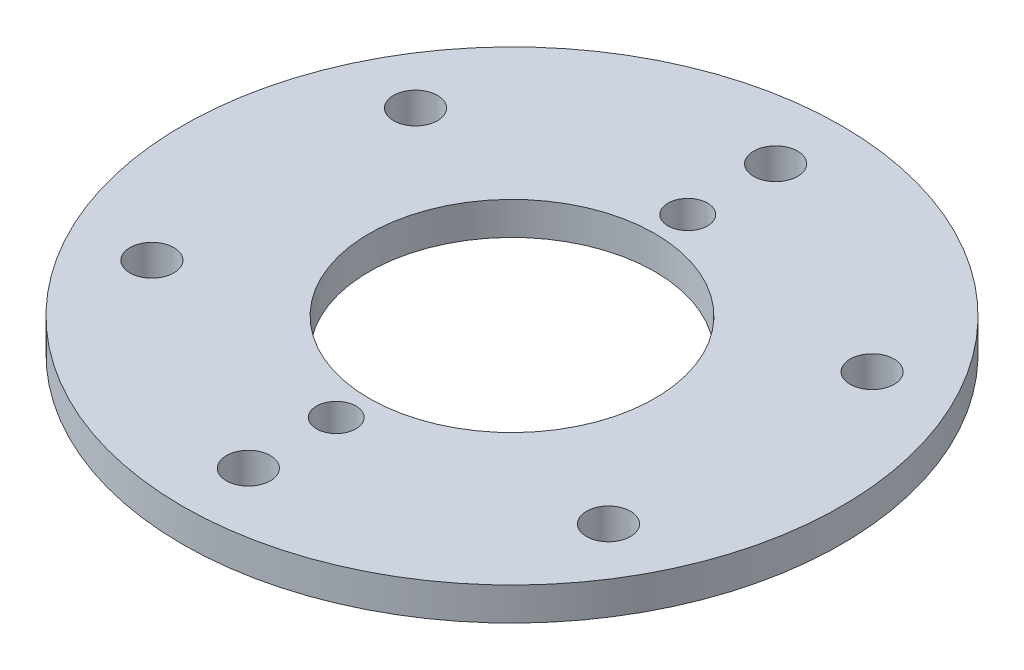
ISO-10303-21;
HEADER;
FILE_DESCRIPTION(('STEP AP214'),'2;1');
FILE_NAME('part.step','',(''),(''),'','','');
FILE_SCHEMA(('AUTOMOTIVE_DESIGN { 1 0 10303 214 1 1 1 1 }'));
ENDSEC;
DATA;
#1=APPLICATION_CONTEXT('core data for automotive mechanical design processes');
#2=APPLICATION_PROTOCOL_DEFINITION('international standard','automotive_design',2000,#1);
#3=PRODUCT_CONTEXT('',#1,'mechanical');
#4=PRODUCT('Part','Part','',(#3));
#5=PRODUCT_RELATED_PRODUCT_CATEGORY('part','',(#4));
#6=PRODUCT_DEFINITION_FORMATION('','',#4);
#7=PRODUCT_DEFINITION_CONTEXT('part definition',#1,'design');
#8=PRODUCT_DEFINITION('design','',#6,#7);
#9=PRODUCT_DEFINITION_SHAPE('','',#8);
#10=(LENGTH_UNIT() NAMED_UNIT(*) SI_UNIT(.MILLI.,.METRE.));
#11=(NAMED_UNIT(*) PLANE_ANGLE_UNIT() SI_UNIT($,.RADIAN.));
#12=(NAMED_UNIT(*) SI_UNIT($,.STERADIAN.) SOLID_ANGLE_UNIT());
#13=UNCERTAINTY_MEASURE_WITH_UNIT(LENGTH_MEASURE(1.E-05),#10,'distance_accuracy_value','');
#14=(GEOMETRIC_REPRESENTATION_CONTEXT(3) GLOBAL_UNCERTAINTY_ASSIGNED_CONTEXT((#13)) GLOBAL_UNIT_ASSIGNED_CONTEXT((#10,
#11,#12)) REPRESENTATION_CONTEXT('',''));
#15=CARTESIAN_POINT('',(0.,0.,0.));
#16=DIRECTION('',(0.,0.,1.));
#17=DIRECTION('',(1.,0.,0.));
#18=AXIS2_PLACEMENT_3D('',#15,#16,#17);
#19=CARTESIAN_POINT('',(0.,15.,0.));
#20=DIRECTION('',(0.,1.,0.));
#21=DIRECTION('',(0.,0.,1.));
#22=AXIS2_PLACEMENT_3D('',#19,#20,#21);
#23=PLANE('',#22);
#24=CARTESIAN_POINT('',(0.,15.,-80.));
#25=DIRECTION('',(0.,1.,0.));
#26=DIRECTION('',(0.,0.,1.));
#27=AXIS2_PLACEMENT_3D('',#24,#25,#26);
#28=CIRCLE('',#27,9.);
#29=CARTESIAN_POINT('',(0.,15.,-71.));
#30=VERTEX_POINT('',#29);
#31=EDGE_CURVE('E100',#30,#30,#28,.T.);
#32=ORIENTED_EDGE('',*,*,#31,.F.);
#33=EDGE_LOOP('',(#32));
#34=FACE_BOUND('',#33,.T.);
#35=CARTESIAN_POINT('',(0.,15.,80.));
#36=DIRECTION('',(0.,1.,0.));
#37=DIRECTION('',(0.,0.,1.));
#38=AXIS2_PLACEMENT_3D('',#35,#36,#37);
#39=CIRCLE('',#38,9.);
#40=CARTESIAN_POINT('',(0.,15.,89.));
#41=VERTEX_POINT('',#40);
#42=EDGE_CURVE('E94',#41,#41,#39,.T.);
#43=ORIENTED_EDGE('',*,*,#42,.F.);
#44=EDGE_LOOP('',(#43));
#45=FACE_BOUND('',#44,.T.);
#46=CARTESIAN_POINT('',(103.923048454132,15.,-60.0000000000012));
#47=DIRECTION('',(0.,1.,0.));
#48=DIRECTION('',(0.,0.,1.));
#49=AXIS2_PLACEMENT_3D('',#46,#47,#48);
#50=CIRCLE('',#49,9.99999999999999);
#51=CARTESIAN_POINT('',(103.923048454132,15.,-50.0000000000012));
#52=VERTEX_POINT('',#51);
#53=EDGE_CURVE('E88',#52,#52,#50,.T.);
#54=ORIENTED_EDGE('',*,*,#53,.F.);
#55=EDGE_LOOP('',(#54));
#56=FACE_BOUND('',#55,.T.);
#57=CARTESIAN_POINT('',(103.923048454133,15.,59.999999999999));
#58=DIRECTION('',(0.,1.,0.));
#59=DIRECTION('',(0.,0.,1.));
#60=AXIS2_PLACEMENT_3D('',#57,#58,#59);
#61=CIRCLE('',#60,9.99999999999999);
#62=CARTESIAN_POINT('',(103.923048454133,15.,69.999999999999));
#63=VERTEX_POINT('',#62);
#64=EDGE_CURVE('E82',#63,#63,#61,.T.);
#65=ORIENTED_EDGE('',*,*,#64,.F.);
#66=EDGE_LOOP('',(#65));
#67=FACE_BOUND('',#66,.T.);
#68=CARTESIAN_POINT('',(0.,15.,120.));
#69=DIRECTION('',(0.,1.,0.));
#70=DIRECTION('',(0.,0.,1.));
#71=AXIS2_PLACEMENT_3D('',#68,#69,#70);
#72=CIRCLE('',#71,10.);
#73=CARTESIAN_POINT('',(0.,15.,130.));
#74=VERTEX_POINT('',#73);
#75=EDGE_CURVE('E76',#74,#74,#72,.T.);
#76=ORIENTED_EDGE('',*,*,#75,.F.);
#77=EDGE_LOOP('',(#76));
#78=FACE_BOUND('',#77,.T.);
#79=CARTESIAN_POINT('',(-103.923048454132,15.,60.0000000000005));
#80=DIRECTION('',(0.,1.,0.));
#81=DIRECTION('',(0.,0.,1.));
#82=AXIS2_PLACEMENT_3D('',#79,#80,#81);
#83=CIRCLE('',#82,9.99999999999999);
#84=CARTESIAN_POINT('',(-103.923048454132,15.,70.0000000000005));
#85=VERTEX_POINT('',#84);
#86=EDGE_CURVE('E70',#85,#85,#83,.T.);
#87=ORIENTED_EDGE('',*,*,#86,.F.);
#88=EDGE_LOOP('',(#87));
#89=FACE_BOUND('',#88,.T.);
#90=CARTESIAN_POINT('',(-103.923048454133,15.,-59.9999999999998));
#91=DIRECTION('',(0.,1.,0.));
#92=DIRECTION('',(0.,0.,1.));
#93=AXIS2_PLACEMENT_3D('',#90,#91,#92);
#94=CIRCLE('',#93,9.99999999999999);
#95=CARTESIAN_POINT('',(-103.923048454133,15.,-49.9999999999998));
#96=VERTEX_POINT('',#95);
#97=EDGE_CURVE('E64',#96,#96,#94,.T.);
#98=ORIENTED_EDGE('',*,*,#97,.F.);
#99=EDGE_LOOP('',(#98));
#100=FACE_BOUND('',#99,.T.);
#101=CARTESIAN_POINT('',(0.,15.,-120.));
#102=DIRECTION('',(0.,1.,0.));
#103=DIRECTION('',(0.,0.,1.));
#104=AXIS2_PLACEMENT_3D('',#101,#102,#103);
#105=CIRCLE('',#104,10.);
#106=CARTESIAN_POINT('',(0.,15.,-110.));
#107=VERTEX_POINT('',#106);
#108=EDGE_CURVE('E58',#107,#107,#105,.T.);
#109=ORIENTED_EDGE('',*,*,#108,.F.);
#110=EDGE_LOOP('',(#109));
#111=FACE_BOUND('',#110,.T.);
#112=CARTESIAN_POINT('',(0.,15.,0.));
#113=DIRECTION('',(0.,1.,0.));
#114=DIRECTION('',(0.,0.,1.));
#115=AXIS2_PLACEMENT_3D('',#112,#113,#114);
#116=CIRCLE('',#115,150.);
#117=CARTESIAN_POINT('',(0.,15.,150.));
#118=VERTEX_POINT('',#117);
#119=EDGE_CURVE('E10',#118,#118,#116,.T.);
#120=ORIENTED_EDGE('',*,*,#119,.T.);
#121=EDGE_LOOP('',(#120));
#122=FACE_BOUND('',#121,.T.);
#123=CARTESIAN_POINT('',(0.,15.,0.));
#124=DIRECTION('',(0.,1.,0.));
#125=DIRECTION('',(0.,0.,1.));
#126=AXIS2_PLACEMENT_3D('',#123,#124,#125);
#127=CIRCLE('',#126,65.);
#128=CARTESIAN_POINT('',(0.,15.,65.));
#129=VERTEX_POINT('',#128);
#130=EDGE_CURVE('E48',#129,#129,#127,.T.);
#131=ORIENTED_EDGE('',*,*,#130,.F.);
#132=EDGE_LOOP('',(#131));
#133=FACE_BOUND('',#132,.T.);
#134=ADVANCED_FACE('F37',(#34,#45,#56,#67,#78,#89,#100,#111,#122,#133),#23,.T.);
#135=CARTESIAN_POINT('',(0.,0.,0.));
#136=DIRECTION('',(0.,1.,0.));
#137=DIRECTION('',(0.,0.,1.));
#138=AXIS2_PLACEMENT_3D('',#135,#136,#137);
#139=PLANE('',#138);
#140=CARTESIAN_POINT('',(0.,0.,-80.));
#141=DIRECTION('',(0.,1.,0.));
#142=DIRECTION('',(0.,0.,1.));
#143=AXIS2_PLACEMENT_3D('',#140,#141,#142);
#144=CIRCLE('',#143,9.);
#145=CARTESIAN_POINT('',(0.,0.,-71.));
#146=VERTEX_POINT('',#145);
#147=EDGE_CURVE('E97',#146,#146,#144,.T.);
#148=ORIENTED_EDGE('',*,*,#147,.T.);
#149=EDGE_LOOP('',(#148));
#150=FACE_BOUND('',#149,.T.);
#151=CARTESIAN_POINT('',(0.,0.,80.));
#152=DIRECTION('',(0.,1.,0.));
#153=DIRECTION('',(0.,0.,1.));
#154=AXIS2_PLACEMENT_3D('',#151,#152,#153);
#155=CIRCLE('',#154,9.);
#156=CARTESIAN_POINT('',(0.,0.,89.));
#157=VERTEX_POINT('',#156);
#158=EDGE_CURVE('E91',#157,#157,#155,.T.);
#159=ORIENTED_EDGE('',*,*,#158,.T.);
#160=EDGE_LOOP('',(#159));
#161=FACE_BOUND('',#160,.T.);
#162=CARTESIAN_POINT('',(103.923048454132,0.,-60.0000000000012));
#163=DIRECTION('',(0.,1.,0.));
#164=DIRECTION('',(0.,0.,1.));
#165=AXIS2_PLACEMENT_3D('',#162,#163,#164);
#166=CIRCLE('',#165,9.99999999999999);
#167=CARTESIAN_POINT('',(103.923048454132,0.,-50.0000000000012));
#168=VERTEX_POINT('',#167);
#169=EDGE_CURVE('E85',#168,#168,#166,.T.);
#170=ORIENTED_EDGE('',*,*,#169,.T.);
#171=EDGE_LOOP('',(#170));
#172=FACE_BOUND('',#171,.T.);
#173=CARTESIAN_POINT('',(103.923048454133,0.,59.999999999999));
#174=DIRECTION('',(0.,1.,0.));
#175=DIRECTION('',(0.,0.,1.));
#176=AXIS2_PLACEMENT_3D('',#173,#174,#175);
#177=CIRCLE('',#176,9.99999999999999);
#178=CARTESIAN_POINT('',(103.923048454133,0.,69.999999999999));
#179=VERTEX_POINT('',#178);
#180=EDGE_CURVE('E79',#179,#179,#177,.T.);
#181=ORIENTED_EDGE('',*,*,#180,.T.);
#182=EDGE_LOOP('',(#181));
#183=FACE_BOUND('',#182,.T.);
#184=CARTESIAN_POINT('',(0.,0.,120.));
#185=DIRECTION('',(0.,1.,0.));
#186=DIRECTION('',(0.,0.,1.));
#187=AXIS2_PLACEMENT_3D('',#184,#185,#186);
#188=CIRCLE('',#187,9.99999999999999);
#189=CARTESIAN_POINT('',(0.,0.,130.));
#190=VERTEX_POINT('',#189);
#191=EDGE_CURVE('E73',#190,#190,#188,.T.);
#192=ORIENTED_EDGE('',*,*,#191,.T.);
#193=EDGE_LOOP('',(#192));
#194=FACE_BOUND('',#193,.T.);
#195=CARTESIAN_POINT('',(-103.923048454132,0.,60.0000000000005));
#196=DIRECTION('',(0.,1.,0.));
#197=DIRECTION('',(0.,0.,1.));
#198=AXIS2_PLACEMENT_3D('',#195,#196,#197);
#199=CIRCLE('',#198,9.99999999999999);
#200=CARTESIAN_POINT('',(-103.923048454132,0.,70.0000000000005));
#201=VERTEX_POINT('',#200);
#202=EDGE_CURVE('E67',#201,#201,#199,.T.);
#203=ORIENTED_EDGE('',*,*,#202,.T.);
#204=EDGE_LOOP('',(#203));
#205=FACE_BOUND('',#204,.T.);
#206=CARTESIAN_POINT('',(-103.923048454133,0.,-59.9999999999998));
#207=DIRECTION('',(0.,1.,0.));
#208=DIRECTION('',(0.,0.,1.));
#209=AXIS2_PLACEMENT_3D('',#206,#207,#208);
#210=CIRCLE('',#209,9.99999999999999);
#211=CARTESIAN_POINT('',(-103.923048454133,0.,-49.9999999999998));
#212=VERTEX_POINT('',#211);
#213=EDGE_CURVE('E61',#212,#212,#210,.T.);
#214=ORIENTED_EDGE('',*,*,#213,.T.);
#215=EDGE_LOOP('',(#214));
#216=FACE_BOUND('',#215,.T.);
#217=CARTESIAN_POINT('',(0.,0.,-120.));
#218=DIRECTION('',(0.,1.,0.));
#219=DIRECTION('',(0.,0.,1.));
#220=AXIS2_PLACEMENT_3D('',#217,#218,#219);
#221=CIRCLE('',#220,9.99999999999999);
#222=CARTESIAN_POINT('',(0.,0.,-110.));
#223=VERTEX_POINT('',#222);
#224=EDGE_CURVE('E53',#223,#223,#221,.T.);
#225=ORIENTED_EDGE('',*,*,#224,.T.);
#226=EDGE_LOOP('',(#225));
#227=FACE_BOUND('',#226,.T.);
#228=CARTESIAN_POINT('',(0.,0.,0.));
#229=DIRECTION('',(0.,1.,0.));
#230=DIRECTION('',(0.,0.,1.));
#231=AXIS2_PLACEMENT_3D('',#228,#229,#230);
#232=CIRCLE('',#231,150.);
#233=CARTESIAN_POINT('',(0.,0.,150.));
#234=VERTEX_POINT('',#233);
#235=EDGE_CURVE('E41',#234,#234,#232,.T.);
#236=ORIENTED_EDGE('',*,*,#235,.F.);
#237=EDGE_LOOP('',(#236));
#238=FACE_BOUND('',#237,.T.);
#239=CARTESIAN_POINT('',(0.,0.,0.));
#240=DIRECTION('',(0.,1.,0.));
#241=DIRECTION('',(0.,0.,1.));
#242=AXIS2_PLACEMENT_3D('',#239,#240,#241);
#243=CIRCLE('',#242,65.);
#244=CARTESIAN_POINT('',(0.,0.,65.));
#245=VERTEX_POINT('',#244);
#246=EDGE_CURVE('E50',#245,#245,#243,.T.);
#247=ORIENTED_EDGE('',*,*,#246,.T.);
#248=EDGE_LOOP('',(#247));
#249=FACE_BOUND('',#248,.T.);
#250=ADVANCED_FACE('F108',(#150,#161,#172,#183,#194,#205,#216,#227,#238,#249),#139,.F.);
#251=CARTESIAN_POINT('',(0.,15.,0.));
#252=DIRECTION('',(0.,-1.,0.));
#253=DIRECTION('',(0.,0.,-1.));
#254=AXIS2_PLACEMENT_3D('',#251,#252,#253);
#255=CYLINDRICAL_SURFACE('',#254,150.);
#256=ORIENTED_EDGE('',*,*,#119,.F.);
#257=EDGE_LOOP('',(#256));
#258=FACE_BOUND('',#257,.T.);
#259=ORIENTED_EDGE('',*,*,#235,.T.);
#260=EDGE_LOOP('',(#259));
#261=FACE_BOUND('',#260,.T.);
#262=ADVANCED_FACE('F39',(#258,#261),#255,.T.);
#263=CARTESIAN_POINT('',(0.,15.,0.));
#264=DIRECTION('',(0.,-1.,0.));
#265=DIRECTION('',(0.,0.,-1.));
#266=AXIS2_PLACEMENT_3D('',#263,#264,#265);
#267=CYLINDRICAL_SURFACE('',#266,65.);
#268=ORIENTED_EDGE('',*,*,#130,.T.);
#269=EDGE_LOOP('',(#268));
#270=FACE_BOUND('',#269,.T.);
#271=ORIENTED_EDGE('',*,*,#246,.F.);
#272=EDGE_LOOP('',(#271));
#273=FACE_BOUND('',#272,.T.);
#274=ADVANCED_FACE('F126',(#270,#273),#267,.F.);
#275=CARTESIAN_POINT('',(0.,15.,-120.));
#276=DIRECTION('',(0.,1.,0.));
#277=DIRECTION('',(0.,0.,1.));
#278=AXIS2_PLACEMENT_3D('',#275,#276,#277);
#279=CYLINDRICAL_SURFACE('',#278,10.);
#280=ORIENTED_EDGE('',*,*,#224,.F.);
#281=EDGE_LOOP('',(#280));
#282=FACE_BOUND('',#281,.T.);
#283=ORIENTED_EDGE('',*,*,#108,.T.);
#284=EDGE_LOOP('',(#283));
#285=FACE_BOUND('',#284,.T.);
#286=ADVANCED_FACE('F129',(#282,#285),#279,.F.);
#287=CARTESIAN_POINT('',(-103.923048454133,15.,-59.9999999999998));
#288=DIRECTION('',(0.,1.,0.));
#289=DIRECTION('',(0.,0.,1.));
#290=AXIS2_PLACEMENT_3D('',#287,#288,#289);
#291=CYLINDRICAL_SURFACE('',#290,9.99999999999999);
#292=ORIENTED_EDGE('',*,*,#213,.F.);
#293=EDGE_LOOP('',(#292));
#294=FACE_BOUND('',#293,.T.);
#295=ORIENTED_EDGE('',*,*,#97,.T.);
#296=EDGE_LOOP('',(#295));
#297=FACE_BOUND('',#296,.T.);
#298=ADVANCED_FACE('F144',(#294,#297),#291,.F.);
#299=CARTESIAN_POINT('',(-103.923048454132,15.,60.0000000000005));
#300=DIRECTION('',(0.,1.,0.));
#301=DIRECTION('',(0.,0.,1.));
#302=AXIS2_PLACEMENT_3D('',#299,#300,#301);
#303=CYLINDRICAL_SURFACE('',#302,9.99999999999999);
#304=ORIENTED_EDGE('',*,*,#202,.F.);
#305=EDGE_LOOP('',(#304));
#306=FACE_BOUND('',#305,.T.);
#307=ORIENTED_EDGE('',*,*,#86,.T.);
#308=EDGE_LOOP('',(#307));
#309=FACE_BOUND('',#308,.T.);
#310=ADVANCED_FACE('F148',(#306,#309),#303,.F.);
#311=CARTESIAN_POINT('',(0.,15.,120.));
#312=DIRECTION('',(0.,1.,0.));
#313=DIRECTION('',(0.,0.,1.));
#314=AXIS2_PLACEMENT_3D('',#311,#312,#313);
#315=CYLINDRICAL_SURFACE('',#314,10.);
#316=ORIENTED_EDGE('',*,*,#191,.F.);
#317=EDGE_LOOP('',(#316));
#318=FACE_BOUND('',#317,.T.);
#319=ORIENTED_EDGE('',*,*,#75,.T.);
#320=EDGE_LOOP('',(#319));
#321=FACE_BOUND('',#320,.T.);
#322=ADVANCED_FACE('F152',(#318,#321),#315,.F.);
#323=CARTESIAN_POINT('',(103.923048454133,15.,59.999999999999));
#324=DIRECTION('',(0.,1.,0.));
#325=DIRECTION('',(0.,0.,1.));
#326=AXIS2_PLACEMENT_3D('',#323,#324,#325);
#327=CYLINDRICAL_SURFACE('',#326,9.99999999999999);
#328=ORIENTED_EDGE('',*,*,#180,.F.);
#329=EDGE_LOOP('',(#328));
#330=FACE_BOUND('',#329,.T.);
#331=ORIENTED_EDGE('',*,*,#64,.T.);
#332=EDGE_LOOP('',(#331));
#333=FACE_BOUND('',#332,.T.);
#334=ADVANCED_FACE('F156',(#330,#333),#327,.F.);
#335=CARTESIAN_POINT('',(103.923048454132,15.,-60.0000000000012));
#336=DIRECTION('',(0.,1.,0.));
#337=DIRECTION('',(0.,0.,1.));
#338=AXIS2_PLACEMENT_3D('',#335,#336,#337);
#339=CYLINDRICAL_SURFACE('',#338,9.99999999999999);
#340=ORIENTED_EDGE('',*,*,#169,.F.);
#341=EDGE_LOOP('',(#340));
#342=FACE_BOUND('',#341,.T.);
#343=ORIENTED_EDGE('',*,*,#53,.T.);
#344=EDGE_LOOP('',(#343));
#345=FACE_BOUND('',#344,.T.);
#346=ADVANCED_FACE('F160',(#342,#345),#339,.F.);
#347=CARTESIAN_POINT('',(0.,15.,80.));
#348=DIRECTION('',(0.,1.,0.));
#349=DIRECTION('',(0.,0.,1.));
#350=AXIS2_PLACEMENT_3D('',#347,#348,#349);
#351=CYLINDRICAL_SURFACE('',#350,9.);
#352=ORIENTED_EDGE('',*,*,#158,.F.);
#353=EDGE_LOOP('',(#352));
#354=FACE_BOUND('',#353,.T.);
#355=ORIENTED_EDGE('',*,*,#42,.T.);
#356=EDGE_LOOP('',(#355));
#357=FACE_BOUND('',#356,.T.);
#358=ADVANCED_FACE('F164',(#354,#357),#351,.F.);
#359=CARTESIAN_POINT('',(0.,15.,-80.));
#360=DIRECTION('',(0.,1.,0.));
#361=DIRECTION('',(0.,0.,1.));
#362=AXIS2_PLACEMENT_3D('',#359,#360,#361);
#363=CYLINDRICAL_SURFACE('',#362,9.);
#364=ORIENTED_EDGE('',*,*,#147,.F.);
#365=EDGE_LOOP('',(#364));
#366=FACE_BOUND('',#365,.T.);
#367=ORIENTED_EDGE('',*,*,#31,.T.);
#368=EDGE_LOOP('',(#367));
#369=FACE_BOUND('',#368,.T.);
#370=ADVANCED_FACE('F104',(#366,#369),#363,.F.);
#371=CLOSED_SHELL('',(#134,#250,#262,#274,#286,#298,#310,#322,#334,#346,#358,#370));
#372=MANIFOLD_SOLID_BREP('B2',#371);
#373=ADVANCED_BREP_SHAPE_REPRESENTATION('',(#18,#372),#14);
#374=SHAPE_DEFINITION_REPRESENTATION(#9,#373);
ENDSEC;
END-ISO-10303-21;
